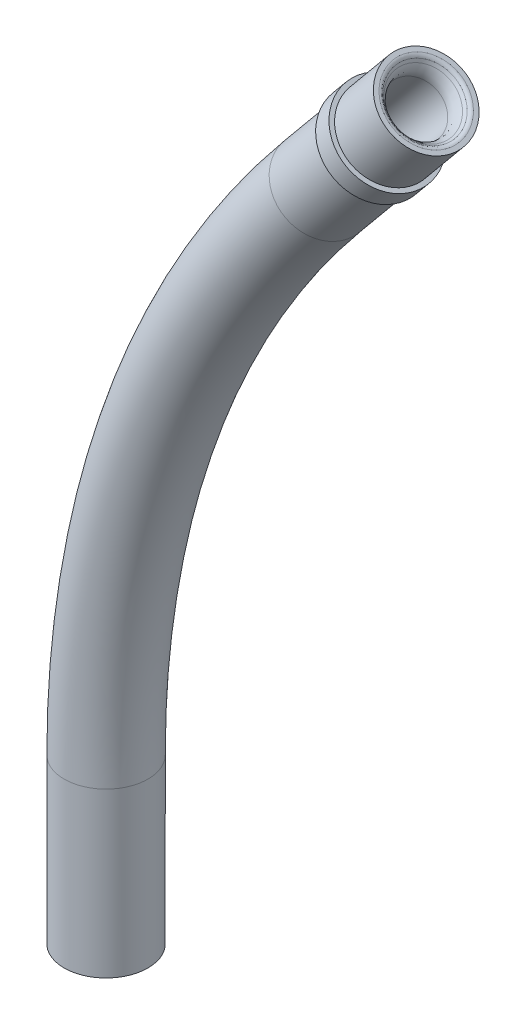
ISO-10303-21;
HEADER;
FILE_DESCRIPTION(('STEP AP214'),'2;1');
FILE_NAME('part.step','',(''),(''),'','','');
FILE_SCHEMA(('AUTOMOTIVE_DESIGN { 1 0 10303 214 1 1 1 1 }'));
ENDSEC;
DATA;
#1=APPLICATION_CONTEXT('core data for automotive mechanical design processes');
#2=APPLICATION_PROTOCOL_DEFINITION('international standard','automotive_design',2000,#1);
#3=PRODUCT_CONTEXT('',#1,'mechanical');
#4=PRODUCT('Part','Part','',(#3));
#5=PRODUCT_RELATED_PRODUCT_CATEGORY('part','',(#4));
#6=PRODUCT_DEFINITION_FORMATION('','',#4);
#7=PRODUCT_DEFINITION_CONTEXT('part definition',#1,'design');
#8=PRODUCT_DEFINITION('design','',#6,#7);
#9=PRODUCT_DEFINITION_SHAPE('','',#8);
#10=(LENGTH_UNIT() NAMED_UNIT(*) SI_UNIT(.MILLI.,.METRE.));
#11=(NAMED_UNIT(*) PLANE_ANGLE_UNIT() SI_UNIT($,.RADIAN.));
#12=(NAMED_UNIT(*) SI_UNIT($,.STERADIAN.) SOLID_ANGLE_UNIT());
#13=UNCERTAINTY_MEASURE_WITH_UNIT(LENGTH_MEASURE(1.E-05),#10,'distance_accuracy_value','');
#14=(GEOMETRIC_REPRESENTATION_CONTEXT(3) GLOBAL_UNCERTAINTY_ASSIGNED_CONTEXT((#13)) GLOBAL_UNIT_ASSIGNED_CONTEXT((#10,
#11,#12)) REPRESENTATION_CONTEXT('',''));
#15=CARTESIAN_POINT('',(0.,0.,0.));
#16=DIRECTION('',(0.,0.,1.));
#17=DIRECTION('',(1.,0.,0.));
#18=AXIS2_PLACEMENT_3D('',#15,#16,#17);
#19=CARTESIAN_POINT('',(30.5777697028413,85.,0.));
#20=DIRECTION('',(-0.637036868809193,-0.770833333333334,0.));
#21=DIRECTION('',(0.770833333333335,-0.637036868809193,0.));
#22=AXIS2_PLACEMENT_3D('',#19,#20,#21);
#23=CYLINDRICAL_SURFACE('',#22,4.425);
#24=CARTESIAN_POINT('',(25.6013848514208,78.9784280772626,0.));
#25=DIRECTION('',(0.637036868809194,0.770833333333333,0.));
#26=DIRECTION('',(-0.770833333333333,0.637036868809194,0.));
#27=AXIS2_PLACEMENT_3D('',#24,#25,#26);
#28=CIRCLE('',#27,4.425);
#29=CARTESIAN_POINT('',(22.1904473514208,81.7973162217433,0.));
#30=VERTEX_POINT('',#29);
#31=EDGE_CURVE('E319',#30,#30,#28,.T.);
#32=ORIENTED_EDGE('',*,*,#31,.T.);
#33=EDGE_LOOP('',(#32));
#34=FACE_BOUND('',#33,.T.);
#35=CARTESIAN_POINT('',(26.8754585890392,80.5200947439292,0.));
#36=DIRECTION('',(0.637036868809194,0.770833333333333,0.));
#37=DIRECTION('',(-0.770833333333333,0.637036868809194,0.));
#38=AXIS2_PLACEMENT_3D('',#35,#36,#37);
#39=CIRCLE('',#38,4.425);
#40=CARTESIAN_POINT('',(23.4645210890392,83.3389828884099,0.));
#41=VERTEX_POINT('',#40);
#42=EDGE_CURVE('E323',#41,#41,#39,.F.);
#43=ORIENTED_EDGE('',*,*,#42,.T.);
#44=EDGE_LOOP('',(#43));
#45=FACE_BOUND('',#44,.T.);
#46=ADVANCED_FACE('F53',(#34,#45),#23,.T.);
#47=CARTESIAN_POINT('',(20.6250000000002,72.9568561545252,0.));
#48=DIRECTION('',(0.637036868809194,0.770833333333334,0.));
#49=DIRECTION('',(-0.770833333333334,0.637036868809194,0.));
#50=AXIS2_PLACEMENT_3D('',#47,#48,#49);
#51=CYLINDRICAL_SURFACE('',#50,4.);
#52=CARTESIAN_POINT('',(20.6249999999999,72.9568561545253,0.));
#53=DIRECTION('',(-0.637036868809194,-0.770833333333333,0.));
#54=DIRECTION('',(0.770833333333333,-0.637036868809194,0.));
#55=AXIS2_PLACEMENT_3D('',#52,#53,#54);
#56=CIRCLE('',#55,4.);
#57=CARTESIAN_POINT('',(17.5416666666668,75.5050036297619,0.));
#58=VERTEX_POINT('',#57);
#59=EDGE_CURVE('E86',#58,#58,#56,.T.);
#60=ORIENTED_EDGE('',*,*,#59,.F.);
#61=EDGE_LOOP('',(#60));
#62=FACE_BOUND('',#61,.T.);
#63=CARTESIAN_POINT('',(25.6013848514207,78.9784280772626,0.));
#64=DIRECTION('',(0.637036868809194,0.770833333333333,0.));
#65=DIRECTION('',(-0.770833333333333,0.637036868809194,0.));
#66=AXIS2_PLACEMENT_3D('',#63,#64,#65);
#67=CIRCLE('',#66,4.);
#68=CARTESIAN_POINT('',(22.5180515180874,81.5265755524994,0.));
#69=VERTEX_POINT('',#68);
#70=EDGE_CURVE('E81',#69,#69,#67,.T.);
#71=ORIENTED_EDGE('',*,*,#70,.F.);
#72=EDGE_LOOP('',(#71));
#73=FACE_BOUND('',#72,.T.);
#74=ADVANCED_FACE('F129',(#62,#73),#51,.T.);
#75=CARTESIAN_POINT('',(0.,0.,0.));
#76=DIRECTION('',(0.,-1.,0.));
#77=DIRECTION('',(1.,0.,0.));
#78=AXIS2_PLACEMENT_3D('',#75,#76,#77);
#79=PLANE('',#78);
#80=CARTESIAN_POINT('',(0.,0.,0.));
#81=DIRECTION('',(0.,-1.,0.));
#82=DIRECTION('',(1.,0.,0.));
#83=AXIS2_PLACEMENT_3D('',#80,#81,#82);
#84=CIRCLE('',#83,2.5);
#85=CARTESIAN_POINT('',(2.5,0.,0.));
#86=VERTEX_POINT('',#85);
#87=EDGE_CURVE('E314',#86,#86,#84,.T.);
#88=ORIENTED_EDGE('',*,*,#87,.F.);
#89=EDGE_LOOP('',(#88));
#90=FACE_BOUND('',#89,.T.);
#91=CARTESIAN_POINT('',(0.,0.,0.));
#92=DIRECTION('',(0.,-1.,0.));
#93=DIRECTION('',(1.,0.,0.));
#94=AXIS2_PLACEMENT_3D('',#91,#92,#93);
#95=CIRCLE('',#94,4.);
#96=CARTESIAN_POINT('',(4.,0.,0.));
#97=VERTEX_POINT('',#96);
#98=EDGE_CURVE('E317',#97,#97,#95,.T.);
#99=ORIENTED_EDGE('',*,*,#98,.T.);
#100=EDGE_LOOP('',(#99));
#101=FACE_BOUND('',#100,.T.);
#102=ADVANCED_FACE('F134',(#90,#101),#79,.T.);
#103=CARTESIAN_POINT('',(0.,0.,0.));
#104=DIRECTION('',(0.,1.,0.));
#105=DIRECTION('',(0.,0.,1.));
#106=AXIS2_PLACEMENT_3D('',#103,#104,#105);
#107=CYLINDRICAL_SURFACE('',#106,4.);
#108=CARTESIAN_POINT('',(0.,15.6235379616971,0.));
#109=DIRECTION('',(0.,-1.,0.));
#110=DIRECTION('',(1.,0.,0.));
#111=AXIS2_PLACEMENT_3D('',#108,#109,#110);
#112=CIRCLE('',#111,4.);
#113=CARTESIAN_POINT('',(-4.00000000000002,15.6235379616971,0.));
#114=VERTEX_POINT('',#113);
#115=EDGE_CURVE('E91',#114,#114,#112,.T.);
#116=ORIENTED_EDGE('',*,*,#115,.T.);
#117=EDGE_LOOP('',(#116));
#118=FACE_BOUND('',#117,.T.);
#119=ORIENTED_EDGE('',*,*,#98,.F.);
#120=EDGE_LOOP('',(#119));
#121=FACE_BOUND('',#120,.T.);
#122=ADVANCED_FACE('F135',(#118,#121),#107,.T.);
#123=CARTESIAN_POINT('',(90.,15.6235379616975,0.));
#124=DIRECTION('',(0.,0.,-1.));
#125=DIRECTION('',(-1.,0.,0.));
#126=AXIS2_PLACEMENT_3D('',#123,#124,#125);
#127=TOROIDAL_SURFACE('',#126,90.,4.);
#128=CARTESIAN_POINT('',(90.,15.6235379616975,0.));
#129=DIRECTION('',(0.,0.,-1.));
#130=DIRECTION('',(-1.,0.,0.));
#131=AXIS2_PLACEMENT_3D('',#128,#129,#130);
#132=CIRCLE('',#131,94.);
#133=EDGE_CURVE('',#114,#58,#132,.T.);
#134=ORIENTED_EDGE('',*,*,#115,.F.);
#135=ORIENTED_EDGE('',*,*,#59,.T.);
#136=ORIENTED_EDGE('',*,*,#133,.T.);
#137=ORIENTED_EDGE('',*,*,#133,.F.);
#138=EDGE_LOOP('',(#134,#136,#135,#137));
#139=FACE_BOUND('',#138,.T.);
#140=ADVANCED_FACE('F133',(#139),#127,.T.);
#141=CARTESIAN_POINT('',(25.6013848514208,78.9784280772626,0.));
#142=DIRECTION('',(0.637036868809194,0.770833333333333,0.));
#143=DIRECTION('',(-0.770833333333333,0.637036868809194,0.));
#144=AXIS2_PLACEMENT_3D('',#141,#142,#143);
#145=PLANE('',#144);
#146=ORIENTED_EDGE('',*,*,#70,.T.);
#147=EDGE_LOOP('',(#146));
#148=FACE_BOUND('',#147,.T.);
#149=ORIENTED_EDGE('',*,*,#31,.F.);
#150=EDGE_LOOP('',(#149));
#151=FACE_BOUND('',#150,.T.);
#152=ADVANCED_FACE('F122',(#148,#151),#145,.F.);
#153=CARTESIAN_POINT('',(17.6283651619462,69.3308399314486,0.));
#154=DIRECTION('',(0.637036868809194,0.770833333333333,0.));
#155=DIRECTION('',(-0.770833333333333,0.637036868809194,0.));
#156=AXIS2_PLACEMENT_3D('',#153,#154,#155);
#157=CYLINDRICAL_SURFACE('',#156,3.99999999999963);
#158=CARTESIAN_POINT('',(26.8754585890392,80.5200947439292,0.));
#159=DIRECTION('',(0.637036868809194,0.770833333333333,0.));
#160=DIRECTION('',(-0.770833333333333,0.637036868809194,0.));
#161=AXIS2_PLACEMENT_3D('',#158,#159,#160);
#162=CIRCLE('',#161,3.99999999999963);
#163=CARTESIAN_POINT('',(23.7921252557061,83.0682422191658,0.));
#164=VERTEX_POINT('',#163);
#165=EDGE_CURVE('E329',#164,#164,#162,.F.);
#166=ORIENTED_EDGE('',*,*,#165,.F.);
#167=EDGE_LOOP('',(#166));
#168=FACE_BOUND('',#167,.T.);
#169=CARTESIAN_POINT('',(30.5777697028413,85.,0.));
#170=DIRECTION('',(0.637036868809194,0.770833333333333,0.));
#171=DIRECTION('',(-0.770833333333333,0.637036868809194,0.));
#172=AXIS2_PLACEMENT_3D('',#169,#170,#171);
#173=CIRCLE('',#172,3.99999999999963);
#174=CARTESIAN_POINT('',(27.4944363695083,87.5481474752365,0.));
#175=VERTEX_POINT('',#174);
#176=EDGE_CURVE('E328',#175,#175,#173,.T.);
#177=ORIENTED_EDGE('',*,*,#176,.F.);
#178=EDGE_LOOP('',(#177));
#179=FACE_BOUND('',#178,.T.);
#180=ADVANCED_FACE('F118',(#168,#179),#157,.T.);
#181=CARTESIAN_POINT('',(26.8754585890392,80.5200947439292,0.));
#182=DIRECTION('',(0.637036868809194,0.770833333333333,0.));
#183=DIRECTION('',(-0.770833333333333,0.637036868809194,0.));
#184=AXIS2_PLACEMENT_3D('',#181,#182,#183);
#185=PLANE('',#184);
#186=ORIENTED_EDGE('',*,*,#42,.F.);
#187=EDGE_LOOP('',(#186));
#188=FACE_BOUND('',#187,.T.);
#189=ORIENTED_EDGE('',*,*,#165,.T.);
#190=EDGE_LOOP('',(#189));
#191=FACE_BOUND('',#190,.T.);
#192=ADVANCED_FACE('F121',(#188,#191),#185,.T.);
#193=CARTESIAN_POINT('',(30.5777697028413,85.,0.));
#194=DIRECTION('',(-0.637036868809194,-0.770833333333333,0.));
#195=DIRECTION('',(0.770833333333333,-0.637036868809194,0.));
#196=AXIS2_PLACEMENT_3D('',#193,#194,#195);
#197=PLANE('',#196);
#198=CARTESIAN_POINT('',(33.331381745121,82.7243428410865,0.));
#199=CARTESIAN_POINT('',(33.331381745121,82.7243428410865,-0.933086446171184));
#200=CARTESIAN_POINT('',(32.7355321096122,83.2167685960085,-2.79925933851356));
#201=CARTESIAN_POINT('',(30.5777697028413,85.,-3.95875052112539));
#202=CARTESIAN_POINT('',(28.4200072960704,86.7832314039916,-2.79925933851355));
#203=CARTESIAN_POINT('',(27.5262328428071,87.5218700363745,0.));
#204=CARTESIAN_POINT('',(28.4200072960704,86.7832314039916,2.79925933851354));
#205=CARTESIAN_POINT('',(30.5777697028413,85.,3.9587505211254));
#206=CARTESIAN_POINT('',(32.7355321096122,83.2167685960085,2.79925933851354));
#207=CARTESIAN_POINT('',(33.331381745121,82.7243428410865,0.933086446171184));
#208=CARTESIAN_POINT('',(33.331381745121,82.7243428410865,0.));
#209=B_SPLINE_CURVE_WITH_KNOTS('',3,(#198,#199,#200,#201,#202,#203,#204,#205,#206,#207,#208),
.UNSPECIFIED.,.T.,.F.,(4,1,1,1,1,1,1,1,4),(0.,0.785398163397448,1.5707963267949,
2.35619449019235,3.14159265358979,3.92699081698724,4.71238898038469,5.49778714378214,
6.28318530717959),.UNSPECIFIED.);
#210=CARTESIAN_POINT('',(33.331381745121,82.7243428410865,0.));
#211=VERTEX_POINT('',#210);
#212=EDGE_CURVE('E66',#211,#211,#209,.F.);
#213=ORIENTED_EDGE('',*,*,#212,.T.);
#214=EDGE_LOOP('',(#213));
#215=FACE_BOUND('',#214,.T.);
#216=ORIENTED_EDGE('',*,*,#176,.T.);
#217=EDGE_LOOP('',(#216));
#218=FACE_BOUND('',#217,.T.);
#219=ADVANCED_FACE('F116',(#215,#218),#197,.F.);
#220=CARTESIAN_POINT('',(0.,-1.,0.));
#221=DIRECTION('',(0.,1.,0.));
#222=DIRECTION('',(0.,0.,1.));
#223=AXIS2_PLACEMENT_3D('',#220,#221,#222);
#224=CYLINDRICAL_SURFACE('',#223,2.5);
#225=CARTESIAN_POINT('',(0.,15.6235379616971,0.));
#226=DIRECTION('',(0.,-1.,0.));
#227=DIRECTION('',(1.,0.,0.));
#228=AXIS2_PLACEMENT_3D('',#225,#226,#227);
#229=CIRCLE('',#228,2.5);
#230=CARTESIAN_POINT('',(-2.50000000000002,15.6235379616971,0.));
#231=VERTEX_POINT('',#230);
#232=EDGE_CURVE('E336',#231,#231,#229,.T.);
#233=ORIENTED_EDGE('',*,*,#232,.F.);
#234=EDGE_LOOP('',(#233));
#235=FACE_BOUND('',#234,.T.);
#236=ORIENTED_EDGE('',*,*,#87,.T.);
#237=EDGE_LOOP('',(#236));
#238=FACE_BOUND('',#237,.T.);
#239=ADVANCED_FACE('F110',(#235,#238),#224,.F.);
#240=CARTESIAN_POINT('',(90.,15.6235379616975,0.));
#241=DIRECTION('',(0.,0.,-1.));
#242=DIRECTION('',(-1.,0.,0.));
#243=AXIS2_PLACEMENT_3D('',#240,#241,#242);
#244=TOROIDAL_SURFACE('',#243,90.,2.5);
#245=CARTESIAN_POINT('',(20.6250000000002,72.9568561545252,0.));
#246=DIRECTION('',(-0.637036868809197,-0.770833333333331,0.));
#247=DIRECTION('',(0.770833333333331,-0.637036868809197,0.));
#248=AXIS2_PLACEMENT_3D('',#245,#246,#247);
#249=CIRCLE('',#248,2.5);
#250=CARTESIAN_POINT('',(18.6979166666668,74.5494483265481,0.));
#251=VERTEX_POINT('',#250);
#252=EDGE_CURVE('E335',#251,#251,#249,.T.);
#253=CARTESIAN_POINT('',(90.,15.6235379616975,0.));
#254=DIRECTION('',(0.,0.,-1.));
#255=DIRECTION('',(-1.,0.,0.));
#256=AXIS2_PLACEMENT_3D('',#253,#254,#255);
#257=CIRCLE('',#256,92.5);
#258=EDGE_CURVE('',#231,#251,#257,.T.);
#259=ORIENTED_EDGE('',*,*,#232,.T.);
#260=ORIENTED_EDGE('',*,*,#252,.F.);
#261=ORIENTED_EDGE('',*,*,#258,.T.);
#262=ORIENTED_EDGE('',*,*,#258,.F.);
#263=EDGE_LOOP('',(#259,#261,#260,#262));
#264=FACE_BOUND('',#263,.T.);
#265=ADVANCED_FACE('F109',(#264),#244,.F.);
#266=CARTESIAN_POINT('',(20.6250000000002,72.9568561545252,0.));
#267=DIRECTION('',(0.637036868809194,0.770833333333334,0.));
#268=DIRECTION('',(-0.770833333333334,0.637036868809194,0.));
#269=AXIS2_PLACEMENT_3D('',#266,#267,#268);
#270=CYLINDRICAL_SURFACE('',#269,2.5);
#271=CARTESIAN_POINT('',(31.4040912506121,82.0754537168167,0.));
#272=CARTESIAN_POINT('',(31.4040912506121,82.0754537168167,0.32720519784583));
#273=CARTESIAN_POINT('',(31.30375162814,82.158377010547,0.981615593537496));
#274=CARTESIAN_POINT('',(30.8751370239262,82.5125953526801,1.81378911132641));
#275=CARTESIAN_POINT('',(30.2336699372972,83.0427205647583,2.36982967895512));
#276=CARTESIAN_POINT('',(29.4770079172787,83.6680458888397,2.56508516052245));
#277=CARTESIAN_POINT('',(28.7203458972602,84.293371212921,2.36982967895512));
#278=CARTESIAN_POINT('',(28.0788788106313,84.8234964249992,1.8137891113264));
#279=CARTESIAN_POINT('',(27.6502642064175,85.1777147671323,0.981615593537479));
#280=CARTESIAN_POINT('',(27.4997547727093,85.3020997077278,0.));
#281=CARTESIAN_POINT('',(27.6502642064175,85.1777147671323,-0.981615593537491));
#282=CARTESIAN_POINT('',(28.0788788106313,84.8234964249992,-1.81378911132641));
#283=CARTESIAN_POINT('',(28.7203458972603,84.293371212921,-2.36982967895512));
#284=CARTESIAN_POINT('',(29.4770079172787,83.6680458888397,-2.56508516052245));
#285=CARTESIAN_POINT('',(30.2336699372972,83.0427205647582,-2.36982967895511));
#286=CARTESIAN_POINT('',(30.8751370239262,82.5125953526801,-1.81378911132641));
#287=CARTESIAN_POINT('',(31.30375162814,82.158377010547,-0.981615593537479));
#288=CARTESIAN_POINT('',(31.4040912506121,82.0754537168167,-0.327205197845829));
#289=CARTESIAN_POINT('',(31.4040912506121,82.0754537168167,0.));
#290=B_SPLINE_CURVE_WITH_KNOTS('',3,(#271,#272,#273,#274,#275,#276,#277,#278,#279,#280,#281,
#282,#283,#284,#285,#286,#287,#288,#289),.UNSPECIFIED.,.T.,.F.,(4,1,1,1,1,1,1,1,1,1,1,1,1,1,1,1,
4),(3.14159265358979,3.53429173528852,3.92699081698724,4.31968989868597,4.71238898038469,
5.10508806208341,5.49778714378214,5.89048622548086,6.28318530717959,6.67588438887831,
7.06858347057703,7.46128255227576,7.85398163397448,8.24668071567321,8.63937979737193,
9.03207887907065,9.42477796076938),.UNSPECIFIED.);
#291=CARTESIAN_POINT('',(31.4040912506121,82.0754537168167,0.));
#292=VERTEX_POINT('',#291);
#293=EDGE_CURVE('E76',#292,#292,#290,.F.);
#294=ORIENTED_EDGE('',*,*,#293,.T.);
#295=EDGE_LOOP('',(#294));
#296=FACE_BOUND('',#295,.T.);
#297=ORIENTED_EDGE('',*,*,#252,.T.);
#298=EDGE_LOOP('',(#297));
#299=FACE_BOUND('',#298,.T.);
#300=ADVANCED_FACE('F99',(#296,#299),#270,.F.);
#301=CARTESIAN_POINT('',(30.5777697028413,85.,0.));
#302=DIRECTION('',(0.637036868809193,0.770833333333334,0.));
#303=DIRECTION('',(-0.770833333333334,0.637036868809193,0.));
#304=AXIS2_PLACEMENT_3D('',#301,#302,#303);
#305=CONICAL_SURFACE('',#304,3.33909963117728,0.69813170079772);
#306=CARTESIAN_POINT('',(32.922356718023,82.8306665090265,0.));
#307=CARTESIAN_POINT('',(32.922356718023,82.8306665090265,0.833039557702626));
#308=CARTESIAN_POINT('',(32.3903949487161,83.2702936569341,2.49911867310787));
#309=CARTESIAN_POINT('',(30.4639909715287,84.8623243912334,3.53428752148901));
#310=CARTESIAN_POINT('',(28.5375869943414,86.4543551255326,2.49911867310787));
#311=CARTESIAN_POINT('',(27.7396443403809,87.1137958473941,0.));
#312=CARTESIAN_POINT('',(28.5375869943414,86.4543551255326,-2.49911867310787));
#313=CARTESIAN_POINT('',(30.4639909715287,84.8623243912334,-3.534287521489));
#314=CARTESIAN_POINT('',(32.3903949487161,83.2702936569342,-2.49911867310788));
#315=CARTESIAN_POINT('',(32.922356718023,82.8306665090265,-0.833039557702626));
#316=CARTESIAN_POINT('',(32.922356718023,82.8306665090265,0.));
#317=B_SPLINE_CURVE_WITH_KNOTS('',3,(#306,#307,#308,#309,#310,#311,#312,#313,#314,#315,#316),
.UNSPECIFIED.,.T.,.F.,(4,1,1,1,1,1,1,1,4),(0.,0.785398163397448,1.5707963267949,
2.35619449019234,3.14159265358979,3.92699081698724,4.71238898038469,5.49778714378214,
6.28318530717959),.UNSPECIFIED.);
#318=CARTESIAN_POINT('',(32.922356718023,82.8306665090265,0.));
#319=VERTEX_POINT('',#318);
#320=EDGE_CURVE('E12',#319,#319,#317,.F.);
#321=ORIENTED_EDGE('',*,*,#320,.T.);
#322=EDGE_LOOP('',(#321));
#323=FACE_BOUND('',#322,.T.);
#324=CARTESIAN_POINT('',(32.583731546505,82.7683413176247,0.));
#325=CARTESIAN_POINT('',(32.583731546505,82.7683413176247,-0.388446377266933));
#326=CARTESIAN_POINT('',(32.4646119142308,82.8667849036455,-1.16533913180079));
#327=CARTESIAN_POINT('',(31.955775895284,83.2873003253716,-2.15326594461047));
#328=CARTESIAN_POINT('',(31.1942489770766,83.9166461288165,-2.81337753675758));
#329=CARTESIAN_POINT('',(30.2959667296468,84.6590101204397,-3.04517790226424));
#330=CARTESIAN_POINT('',(29.397684482217,85.4013741120629,-2.81337753675759));
#331=CARTESIAN_POINT('',(28.6361575640096,86.0307199155078,-2.15326594461047));
#332=CARTESIAN_POINT('',(28.1273215450628,86.4512353372339,-1.16533913180081));
#333=CARTESIAN_POINT('',(27.9486420966515,86.598900716265,0.));
#334=CARTESIAN_POINT('',(28.1273215450628,86.4512353372339,1.16533913180079));
#335=CARTESIAN_POINT('',(28.6361575640096,86.0307199155078,2.15326594461046));
#336=CARTESIAN_POINT('',(29.397684482217,85.4013741120629,2.81337753675758));
#337=CARTESIAN_POINT('',(30.2959667296468,84.6590101204397,3.04517790226424));
#338=CARTESIAN_POINT('',(31.1942489770766,83.9166461288165,2.81337753675759));
#339=CARTESIAN_POINT('',(31.955775895284,83.2873003253716,2.15326594461047));
#340=CARTESIAN_POINT('',(32.4646119142308,82.8667849036456,1.16533913180081));
#341=CARTESIAN_POINT('',(32.583731546505,82.7683413176247,0.388446377266935));
#342=CARTESIAN_POINT('',(32.583731546505,82.7683413176247,0.));
#343=B_SPLINE_CURVE_WITH_KNOTS('',3,(#324,#325,#326,#327,#328,#329,#330,#331,#332,#333,#334,
#335,#336,#337,#338,#339,#340,#341,#342),.UNSPECIFIED.,.T.,.F.,(4,1,1,1,1,1,1,1,1,1,1,1,1,1,1,1,
4),(3.14159265358979,3.53429173528852,3.92699081698724,4.31968989868597,4.71238898038469,
5.10508806208341,5.49778714378214,5.89048622548086,6.28318530717959,6.67588438887831,
7.06858347057703,7.46128255227576,7.85398163397448,8.24668071567321,8.63937979737193,
9.03207887907065,9.42477796076938),.UNSPECIFIED.);
#344=CARTESIAN_POINT('',(32.583731546505,82.7683413176247,0.));
#345=VERTEX_POINT('',#344);
#346=EDGE_CURVE('E71',#345,#345,#343,.F.);
#347=ORIENTED_EDGE('',*,*,#346,.T.);
#348=EDGE_LOOP('',(#347));
#349=FACE_BOUND('',#348,.T.);
#350=ADVANCED_FACE('F108',(#323,#349),#305,.F.);
#351=CARTESIAN_POINT('',(31.4040912506121,82.0754537168167,0.));
#352=CARTESIAN_POINT('',(31.4040912506121,82.0754537168167,-0.327205197845829));
#353=CARTESIAN_POINT('',(31.30375162814,82.158377010547,-0.981615593537479));
#354=CARTESIAN_POINT('',(30.8751370239262,82.5125953526801,-1.81378911132641));
#355=CARTESIAN_POINT('',(30.2336699372972,83.0427205647582,-2.36982967895511));
#356=CARTESIAN_POINT('',(29.4770079172787,83.6680458888397,-2.56508516052245));
#357=CARTESIAN_POINT('',(28.7203458972603,84.293371212921,-2.36982967895512));
#358=CARTESIAN_POINT('',(28.0788788106313,84.8234964249992,-1.81378911132641));
#359=CARTESIAN_POINT('',(27.6502642064175,85.1777147671323,-0.981615593537491));
#360=CARTESIAN_POINT('',(27.4997547727093,85.3020997077278,0.));
#361=CARTESIAN_POINT('',(27.6502642064175,85.1777147671323,0.981615593537479));
#362=CARTESIAN_POINT('',(28.0788788106313,84.8234964249992,1.8137891113264));
#363=CARTESIAN_POINT('',(28.7203458972602,84.293371212921,2.36982967895512));
#364=CARTESIAN_POINT('',(29.4770079172787,83.6680458888397,2.56508516052245));
#365=CARTESIAN_POINT('',(30.2336699372972,83.0427205647583,2.36982967895512));
#366=CARTESIAN_POINT('',(30.8751370239262,82.5125953526801,1.81378911132641));
#367=CARTESIAN_POINT('',(31.30375162814,82.158377010547,0.981615593537496));
#368=CARTESIAN_POINT('',(31.4040912506121,82.0754537168167,0.32720519784583));
#369=CARTESIAN_POINT('',(31.4040912506121,82.0754537168167,0.));
#370=CARTESIAN_POINT('',(31.4894176738233,82.1787011965869,0.));
#371=CARTESIAN_POINT('',(31.4894176738233,82.1787011965869,-0.327205197845829));
#372=CARTESIAN_POINT('',(31.3890780513512,82.2616244903172,-0.981615593537479));
#373=CARTESIAN_POINT('',(30.9604634471373,82.6158428324503,-1.81378911132641));
#374=CARTESIAN_POINT('',(30.3189963605084,83.1459680445285,-2.36982967895511));
#375=CARTESIAN_POINT('',(29.5623343404899,83.7712933686099,-2.56508516052245));
#376=CARTESIAN_POINT('',(28.8056723204715,84.3966186926913,-2.36982967895512));
#377=CARTESIAN_POINT('',(28.1642052338425,84.9267439047695,-1.81378911132641));
#378=CARTESIAN_POINT('',(27.7355906296287,85.2809622469026,-0.981615593537491));
#379=CARTESIAN_POINT('',(27.5850811959205,85.4053471874981,0.));
#380=CARTESIAN_POINT('',(27.7355906296287,85.2809622469026,0.981615593537479));
#381=CARTESIAN_POINT('',(28.1642052338425,84.9267439047695,1.8137891113264));
#382=CARTESIAN_POINT('',(28.8056723204714,84.3966186926913,2.36982967895512));
#383=CARTESIAN_POINT('',(29.5623343404899,83.7712933686099,2.56508516052245));
#384=CARTESIAN_POINT('',(30.3189963605084,83.1459680445285,2.36982967895512));
#385=CARTESIAN_POINT('',(30.9604634471374,82.6158428324504,1.81378911132641));
#386=CARTESIAN_POINT('',(31.3890780513512,82.2616244903172,0.981615593537496));
#387=CARTESIAN_POINT('',(31.4894176738233,82.1787011965869,0.32720519784583));
#388=CARTESIAN_POINT('',(31.4894176738233,82.1787011965869,0.));
#389=CARTESIAN_POINT('',(31.5747440970345,82.2819486763572,0.));
#390=CARTESIAN_POINT('',(31.5747440970345,82.2819486763572,-0.327205197845829));
#391=CARTESIAN_POINT('',(31.4744044745624,82.3648719700875,-0.98161559353748));
#392=CARTESIAN_POINT('',(31.0457898703485,82.7190903122206,-1.81378911132641));
#393=CARTESIAN_POINT('',(30.4043227837196,83.2492155242988,-2.36982967895511));
#394=CARTESIAN_POINT('',(29.6476607637011,83.8745408483802,-2.56508516052245));
#395=CARTESIAN_POINT('',(28.8909987436826,84.4998661724616,-2.36982967895512));
#396=CARTESIAN_POINT('',(28.2495316570537,85.0299913845398,-1.81378911132641));
#397=CARTESIAN_POINT('',(27.8209170528399,85.3842097266729,-0.981615593537491));
#398=CARTESIAN_POINT('',(27.6704076191317,85.5085946672684,0.));
#399=CARTESIAN_POINT('',(27.8209170528399,85.3842097266729,0.98161559353748));
#400=CARTESIAN_POINT('',(28.2495316570537,85.0299913845398,1.8137891113264));
#401=CARTESIAN_POINT('',(28.8909987436826,84.4998661724616,2.36982967895512));
#402=CARTESIAN_POINT('',(29.6476607637011,83.8745408483802,2.56508516052245));
#403=CARTESIAN_POINT('',(30.4043227837196,83.2492155242988,2.36982967895512));
#404=CARTESIAN_POINT('',(31.0457898703486,82.7190903122206,1.81378911132641));
#405=CARTESIAN_POINT('',(31.4744044745624,82.3648719700876,0.981615593537496));
#406=CARTESIAN_POINT('',(31.5747440970345,82.2819486763572,0.32720519784583));
#407=CARTESIAN_POINT('',(31.5747440970345,82.2819486763572,0.));
#408=CARTESIAN_POINT('',(31.7820055715882,82.4981400424254,0.));
#409=CARTESIAN_POINT('',(31.7820055715882,82.4981400424254,-0.330090124506841));
#410=CARTESIAN_POINT('',(31.6807812674119,82.581794460302,-0.990270373520517));
#411=CARTESIAN_POINT('',(31.2483876226843,82.9391359005574,-1.82978105949585));
#412=CARTESIAN_POINT('',(30.601264802245,83.473935159283,-2.39072416616952));
#413=CARTESIAN_POINT('',(29.837931389323,84.1047738973051,-2.58770119051243));
#414=CARTESIAN_POINT('',(29.0745979764009,84.7356126353271,-2.39072416616952));
#415=CARTESIAN_POINT('',(28.4274751559616,85.2704118940527,-1.82978105949585));
#416=CARTESIAN_POINT('',(27.9950815112339,85.6277533343081,-0.990270373520528));
#417=CARTESIAN_POINT('',(27.8432450549696,85.753234961123,0.));
#418=CARTESIAN_POINT('',(27.9950815112339,85.6277533343081,0.990270373520518));
#419=CARTESIAN_POINT('',(28.4274751559616,85.2704118940527,1.82978105949583));
#420=CARTESIAN_POINT('',(29.0745979764009,84.7356126353271,2.39072416616952));
#421=CARTESIAN_POINT('',(29.837931389323,84.1047738973051,2.58770119051243));
#422=CARTESIAN_POINT('',(30.601264802245,83.473935159283,2.39072416616952));
#423=CARTESIAN_POINT('',(31.2483876226843,82.9391359005575,1.82978105949584));
#424=CARTESIAN_POINT('',(31.6807812674119,82.581794460302,0.990270373520533));
#425=CARTESIAN_POINT('',(31.7820055715882,82.4981400424254,0.330090124506842));
#426=CARTESIAN_POINT('',(31.7820055715882,82.4981400424254,0.));
#427=CARTESIAN_POINT('',(32.0305146993585,82.6441073291646,0.));
#428=CARTESIAN_POINT('',(32.0305146993585,82.6441073291646,-0.342991508203676));
#429=CARTESIAN_POINT('',(31.9253341011563,82.7310313321115,-1.02897452461102));
#430=CARTESIAN_POINT('',(31.476040598164,83.1023392581514,-1.90129700552733));
#431=CARTESIAN_POINT('',(30.8036253524578,83.6580408399862,-2.48416425265236));
#432=CARTESIAN_POINT('',(30.0104574897367,84.3135355492289,-2.6888400113161));
#433=CARTESIAN_POINT('',(29.2172896270158,84.9690302584715,-2.48416425265236));
#434=CARTESIAN_POINT('',(28.5448743813094,85.5247318403063,-1.90129700552733));
#435=CARTESIAN_POINT('',(28.0955808783172,85.8960397663462,-1.02897452461103));
#436=CARTESIAN_POINT('',(27.9378099810139,86.0264257707666,0.));
#437=CARTESIAN_POINT('',(28.0955808783172,85.8960397663462,1.02897452461102));
#438=CARTESIAN_POINT('',(28.5448743813094,85.5247318403063,1.90129700552732));
#439=CARTESIAN_POINT('',(29.2172896270157,84.9690302584715,2.48416425265236));
#440=CARTESIAN_POINT('',(30.0104574897367,84.3135355492289,2.6888400113161));
#441=CARTESIAN_POINT('',(30.8036253524578,83.6580408399862,2.48416425265236));
#442=CARTESIAN_POINT('',(31.4760405981641,83.1023392581515,1.90129700552733));
#443=CARTESIAN_POINT('',(31.9253341011563,82.7310313321115,1.02897452461104));
#444=CARTESIAN_POINT('',(32.0305146993585,82.6441073291646,0.342991508203678));
#445=CARTESIAN_POINT('',(32.0305146993585,82.6441073291646,0.));
#446=CARTESIAN_POINT('',(32.3202714803454,82.7198505365747,0.));
#447=CARTESIAN_POINT('',(32.3202714803454,82.7198505365747,-0.365909348936333));
#448=CARTESIAN_POINT('',(32.2080629757953,82.8125825855161,-1.09772804680899));
#449=CARTESIAN_POINT('',(31.7287487967878,83.2087003850025,-2.02833694942087));
#450=CARTESIAN_POINT('',(31.0114044343578,83.8015325664083,-2.65014993840362));
#451=CARTESIAN_POINT('',(30.1652390649425,84.5008258041516,-2.86850162293346));
#452=CARTESIAN_POINT('',(29.3190736955272,85.2001190418948,-2.65014993840362));
#453=CARTESIAN_POINT('',(28.6017293330973,85.7929512233006,-2.02833694942087));
#454=CARTESIAN_POINT('',(28.1224151540897,86.1890690227871,-1.09772804680901));
#455=CARTESIAN_POINT('',(27.9541023972646,86.3281670961992,0.));
#456=CARTESIAN_POINT('',(28.1224151540897,86.189069022787,1.09772804680899));
#457=CARTESIAN_POINT('',(28.6017293330973,85.7929512233007,2.02833694942085));
#458=CARTESIAN_POINT('',(29.3190736955272,85.2001190418948,2.65014993840363));
#459=CARTESIAN_POINT('',(30.1652390649425,84.5008258041516,2.86850162293346));
#460=CARTESIAN_POINT('',(31.0114044343578,83.8015325664084,2.65014993840363));
#461=CARTESIAN_POINT('',(31.7287487967878,83.2087003850025,2.02833694942086));
#462=CARTESIAN_POINT('',(32.2080629757953,82.8125825855161,1.09772804680901));
#463=CARTESIAN_POINT('',(32.3202714803454,82.7198505365747,0.365909348936335));
#464=CARTESIAN_POINT('',(32.3202714803454,82.7198505365747,0.));
#465=CARTESIAN_POINT('',(32.4520015134252,82.7440959270997,0.));
#466=CARTESIAN_POINT('',(32.4520015134252,82.7440959270997,-0.377177863101634));
#467=CARTESIAN_POINT('',(32.336337445013,82.8396837445808,-1.13153358930489));
#468=CARTESIAN_POINT('',(31.8422623460359,83.248000355187,-2.09080144701568));
#469=CARTESIAN_POINT('',(31.1028267057172,83.8590893476124,-2.73176373758061));
#470=CARTESIAN_POINT('',(30.2306028972947,84.5799179622957,-2.95683976259886));
#471=CARTESIAN_POINT('',(29.3583790888721,85.3007465769789,-2.73176373758061));
#472=CARTESIAN_POINT('',(28.6189434485534,85.9118355694042,-2.09080144701568));
#473=CARTESIAN_POINT('',(28.1248683495763,86.3201521800105,-1.13153358930491));
#474=CARTESIAN_POINT('',(27.9513722469581,86.4635339062322,0.));
#475=CARTESIAN_POINT('',(28.1248683495763,86.3201521800105,1.1315335893049));
#476=CARTESIAN_POINT('',(28.6189434485534,85.9118355694043,2.09080144701566));
#477=CARTESIAN_POINT('',(29.3583790888721,85.3007465769789,2.73176373758061));
#478=CARTESIAN_POINT('',(30.2306028972947,84.5799179622956,2.95683976259885));
#479=CARTESIAN_POINT('',(31.1028267057172,83.8590893476125,2.73176373758062));
#480=CARTESIAN_POINT('',(31.8422623460359,83.2480003551871,2.09080144701567));
#481=CARTESIAN_POINT('',(32.3363374450131,82.8396837445808,1.13153358930491));
#482=CARTESIAN_POINT('',(32.4520015134252,82.7440959270997,0.377177863101635));
#483=CARTESIAN_POINT('',(32.4520015134252,82.7440959270997,0.));
#484=CARTESIAN_POINT('',(32.5837315465051,82.7683413176247,0.));
#485=CARTESIAN_POINT('',(32.5837315465051,82.7683413176247,-0.388446377266935));
#486=CARTESIAN_POINT('',(32.4646119142308,82.8667849036455,-1.1653391318008));
#487=CARTESIAN_POINT('',(31.9557758952841,83.2873003253716,-2.15326594461049));
#488=CARTESIAN_POINT('',(31.1942489770766,83.9166461288165,-2.81337753675759));
#489=CARTESIAN_POINT('',(30.2959667296468,84.6590101204397,-3.04517790226425));
#490=CARTESIAN_POINT('',(29.397684482217,85.4013741120629,-2.8133775367576));
#491=CARTESIAN_POINT('',(28.6361575640096,86.0307199155078,-2.15326594461048));
#492=CARTESIAN_POINT('',(28.1273215450628,86.4512353372339,-1.16533913180081));
#493=CARTESIAN_POINT('',(27.9486420966515,86.5989007162651,0.));
#494=CARTESIAN_POINT('',(28.1273215450628,86.4512353372339,1.1653391318008));
#495=CARTESIAN_POINT('',(28.6361575640096,86.0307199155078,2.15326594461047));
#496=CARTESIAN_POINT('',(29.397684482217,85.4013741120629,2.8133775367576));
#497=CARTESIAN_POINT('',(30.2959667296468,84.6590101204397,3.04517790226425));
#498=CARTESIAN_POINT('',(31.1942489770766,83.9166461288165,2.8133775367576));
#499=CARTESIAN_POINT('',(31.9557758952841,83.2873003253716,2.15326594461048));
#500=CARTESIAN_POINT('',(32.4646119142308,82.8667849036456,1.16533913180082));
#501=CARTESIAN_POINT('',(32.5837315465051,82.7683413176247,0.388446377266937));
#502=CARTESIAN_POINT('',(32.5837315465051,82.7683413176247,0.));
#503=B_SPLINE_SURFACE_WITH_KNOTS('',5,3,((#351,#352,#353,#354,#355,#356,#357,#358,#359,#360,
#361,#362,#363,#364,#365,#366,#367,#368,#369),(#370,#371,#372,#373,#374,#375,#376,#377,#378,
#379,#380,#381,#382,#383,#384,#385,#386,#387,#388),(#389,#390,#391,#392,#393,#394,#395,#396,
#397,#398,#399,#400,#401,#402,#403,#404,#405,#406,#407),(#408,#409,#410,#411,#412,#413,#414,
#415,#416,#417,#418,#419,#420,#421,#422,#423,#424,#425,#426),(#427,#428,#429,#430,#431,#432,
#433,#434,#435,#436,#437,#438,#439,#440,#441,#442,#443,#444,#445),(#446,#447,#448,#449,#450,
#451,#452,#453,#454,#455,#456,#457,#458,#459,#460,#461,#462,#463,#464),(#465,#466,#467,#468,
#469,#470,#471,#472,#473,#474,#475,#476,#477,#478,#479,#480,#481,#482,#483),(#484,#485,#486,
#487,#488,#489,#490,#491,#492,#493,#494,#495,#496,#497,#498,#499,#500,#501,#502)),.UNSPECIFIED.,
.F.,.T.,.F.,(6,2,6),(4,1,1,1,1,1,1,1,1,1,1,1,1,1,1,1,4),(0.,0.5,1.),(3.14159265358979,
3.53429173528852,3.92699081698724,4.31968989868597,4.71238898038469,5.10508806208341,
5.49778714378214,5.89048622548086,6.28318530717959,6.67588438887831,7.06858347057703,
7.46128255227576,7.85398163397448,8.24668071567321,8.63937979737193,9.03207887907065,
9.42477796076938),.UNSPECIFIED.);
#504=ORIENTED_EDGE('',*,*,#346,.F.);
#505=EDGE_LOOP('',(#504));
#506=FACE_BOUND('',#505,.T.);
#507=ORIENTED_EDGE('',*,*,#293,.F.);
#508=EDGE_LOOP('',(#507));
#509=FACE_BOUND('',#508,.T.);
#510=ADVANCED_FACE('F174',(#506,#509),#503,.T.);
#511=CARTESIAN_POINT('',(33.331381745121,82.7243428410865,0.));
#512=CARTESIAN_POINT('',(33.331381745121,82.7243428410865,0.933086446171184));
#513=CARTESIAN_POINT('',(32.7355321096122,83.2167685960085,2.79925933851354));
#514=CARTESIAN_POINT('',(30.5777697028413,85.,3.9587505211254));
#515=CARTESIAN_POINT('',(28.4200072960704,86.7832314039916,2.79925933851354));
#516=CARTESIAN_POINT('',(27.5262328428071,87.5218700363745,0.));
#517=CARTESIAN_POINT('',(28.4200072960704,86.7832314039916,-2.79925933851355));
#518=CARTESIAN_POINT('',(30.5777697028413,85.,-3.95875052112539));
#519=CARTESIAN_POINT('',(32.7355321096122,83.2167685960085,-2.79925933851356));
#520=CARTESIAN_POINT('',(33.331381745121,82.7243428410865,-0.933086446171184));
#521=CARTESIAN_POINT('',(33.331381745121,82.7243428410865,0.));
#522=CARTESIAN_POINT('',(33.2986774553514,82.7513705232722,0.));
#523=CARTESIAN_POINT('',(33.2986774553514,82.7513705232722,0.922004300593983));
#524=CARTESIAN_POINT('',(32.7099046479649,83.237947801963,2.76601290178194));
#525=CARTESIAN_POINT('',(30.5777697028413,85.,3.91173295939898));
#526=CARTESIAN_POINT('',(28.4456347577177,86.7620521980371,2.76601290178194));
#527=CARTESIAN_POINT('',(27.5624755466379,87.4919181160733,0.));
#528=CARTESIAN_POINT('',(28.4456347577177,86.7620521980371,-2.76601290178194));
#529=CARTESIAN_POINT('',(30.5777697028413,85.,-3.91173295939897));
#530=CARTESIAN_POINT('',(32.7099046479649,83.237947801963,-2.76601290178196));
#531=CARTESIAN_POINT('',(33.2986774553514,82.7513705232722,-0.922004300593983));
#532=CARTESIAN_POINT('',(33.2986774553514,82.7513705232722,0.));
#533=CARTESIAN_POINT('',(33.2659731655818,82.7783982054579,0.));
#534=CARTESIAN_POINT('',(33.2659731655818,82.7783982054579,0.910922155016784));
#535=CARTESIAN_POINT('',(32.6842771863176,83.2591270079176,2.73276646505034));
#536=CARTESIAN_POINT('',(30.5777697028413,85.,3.86471539767255));
#537=CARTESIAN_POINT('',(28.471262219365,86.7408729920825,2.73276646505033));
#538=CARTESIAN_POINT('',(27.5987182504687,87.461966195772,0.));
#539=CARTESIAN_POINT('',(28.471262219365,86.7408729920825,-2.73276646505034));
#540=CARTESIAN_POINT('',(30.5777697028413,85.,-3.86471539767255));
#541=CARTESIAN_POINT('',(32.6842771863176,83.2591270079176,-2.73276646505036));
#542=CARTESIAN_POINT('',(33.2659731655818,82.7783982054579,-0.910922155016784));
#543=CARTESIAN_POINT('',(33.2659731655818,82.7783982054579,0.));
#544=CARTESIAN_POINT('',(33.1872714757056,82.8317920600384,0.));
#545=CARTESIAN_POINT('',(33.1872714757056,82.8317920600384,0.88619144007908));
#546=CARTESIAN_POINT('',(32.6213680176402,83.2994695090861,2.65857432023723));
#547=CARTESIAN_POINT('',(30.5720503124573,84.9930793695465,3.75979186025631));
#548=CARTESIAN_POINT('',(28.5227326072745,86.686689230007,2.65857432023722));
#549=CARTESIAN_POINT('',(27.6738774201764,87.3882054035785,0.));
#550=CARTESIAN_POINT('',(28.5227326072745,86.686689230007,-2.65857432023723));
#551=CARTESIAN_POINT('',(30.5720503124573,84.9930793695465,-3.7597918602563));
#552=CARTESIAN_POINT('',(32.6213680176402,83.2994695090861,-2.65857432023724));
#553=CARTESIAN_POINT('',(33.1872714757056,82.8317920600384,-0.88619144007908));
#554=CARTESIAN_POINT('',(33.1872714757056,82.8317920600384,0.));
#555=CARTESIAN_POINT('',(33.1005502051835,82.854334748039,0.));
#556=CARTESIAN_POINT('',(33.1005502051835,82.854334748039,0.864979551551533));
#557=CARTESIAN_POINT('',(32.5481922188152,83.310817864274,2.59493865465459));
#558=CARTESIAN_POINT('',(30.5479270058523,84.9638894595871,3.66979743893875));
#559=CARTESIAN_POINT('',(28.5476617928894,86.6169610549002,2.59493865465458));
#560=CARTESIAN_POINT('',(27.719124813337,87.3016857292526,0.));
#561=CARTESIAN_POINT('',(28.5476617928894,86.6169610549002,-2.59493865465459));
#562=CARTESIAN_POINT('',(30.5479270058523,84.9638894595871,-3.66979743893874));
#563=CARTESIAN_POINT('',(32.5481922188152,83.310817864274,-2.59493865465461));
#564=CARTESIAN_POINT('',(33.1005502051835,82.854334748039,-0.864979551551533));
#565=CARTESIAN_POINT('',(33.1005502051835,82.854334748039,0.));
#566=CARTESIAN_POINT('',(33.0058093540155,82.8460262694598,0.));
#567=CARTESIAN_POINT('',(33.0058093540155,82.8460262694598,0.847286489434159));
#568=CARTESIAN_POINT('',(32.4647497898426,83.2931720734813,2.54185946830247));
#569=CARTESIAN_POINT('',(30.5053997830262,84.9124302701217,3.59473213371983));
#570=CARTESIAN_POINT('',(28.5460497762097,86.5316884667621,2.54185946830246));
#571=CARTESIAN_POINT('',(27.7344604299505,87.2024071727944,0.));
#572=CARTESIAN_POINT('',(28.5460497762097,86.5316884667621,-2.54185946830247));
#573=CARTESIAN_POINT('',(30.5053997830262,84.9124302701217,-3.59473213371982));
#574=CARTESIAN_POINT('',(32.4647497898426,83.2931720734813,-2.54185946830248));
#575=CARTESIAN_POINT('',(33.0058093540155,82.8460262694598,-0.847286489434159));
#576=CARTESIAN_POINT('',(33.0058093540155,82.8460262694598,0.));
#577=CARTESIAN_POINT('',(32.9640830360192,82.8383463892431,0.));
#578=CARTESIAN_POINT('',(32.9640830360192,82.8383463892431,0.840163023568391));
#579=CARTESIAN_POINT('',(32.4275723692793,83.2817328652077,2.52048907070517));
#580=CARTESIAN_POINT('',(30.4846953772775,84.8873773306776,3.56450982760441));
#581=CARTESIAN_POINT('',(28.5418183852755,86.4930217961473,2.52048907070516));
#582=CARTESIAN_POINT('',(27.7370523851657,87.1581015100942,0.));
#583=CARTESIAN_POINT('',(28.5418183852756,86.4930217961474,-2.52048907070517));
#584=CARTESIAN_POINT('',(30.4846953772775,84.8873773306775,-3.56450982760441));
#585=CARTESIAN_POINT('',(32.4275723692793,83.2817328652078,-2.52048907070518));
#586=CARTESIAN_POINT('',(32.9640830360192,82.8383463892431,-0.840163023568391));
#587=CARTESIAN_POINT('',(32.9640830360192,82.8383463892431,0.));
#588=CARTESIAN_POINT('',(32.922356718023,82.8306665090265,0.));
#589=CARTESIAN_POINT('',(32.922356718023,82.8306665090265,0.833039557702624));
#590=CARTESIAN_POINT('',(32.390394948716,83.2702936569341,2.49911867310786));
#591=CARTESIAN_POINT('',(30.4639909715287,84.8623243912334,3.534287521489));
#592=CARTESIAN_POINT('',(28.5375869943414,86.4543551255326,2.49911867310786));
#593=CARTESIAN_POINT('',(27.7396443403809,87.1137958473941,0.));
#594=CARTESIAN_POINT('',(28.5375869943414,86.4543551255326,-2.49911867310787));
#595=CARTESIAN_POINT('',(30.4639909715287,84.8623243912334,-3.53428752148899));
#596=CARTESIAN_POINT('',(32.390394948716,83.2702936569342,-2.49911867310788));
#597=CARTESIAN_POINT('',(32.922356718023,82.8306665090265,-0.833039557702624));
#598=CARTESIAN_POINT('',(32.922356718023,82.8306665090265,0.));
#599=B_SPLINE_SURFACE_WITH_KNOTS('',5,3,((#511,#512,#513,#514,#515,#516,#517,#518,#519,#520,
#521),(#522,#523,#524,#525,#526,#527,#528,#529,#530,#531,#532),(#533,#534,#535,#536,#537,#538,
#539,#540,#541,#542,#543),(#544,#545,#546,#547,#548,#549,#550,#551,#552,#553,#554),(#555,#556,
#557,#558,#559,#560,#561,#562,#563,#564,#565),(#566,#567,#568,#569,#570,#571,#572,#573,#574,
#575,#576),(#577,#578,#579,#580,#581,#582,#583,#584,#585,#586,#587),(#588,#589,#590,#591,#592,
#593,#594,#595,#596,#597,#598)),.UNSPECIFIED.,.F.,.T.,.F.,(6,2,6),(4,1,1,1,1,1,1,1,4),(0.,0.5,
1.),(0.,0.785398163397448,1.5707963267949,2.35619449019234,3.14159265358979,3.92699081698724,
4.71238898038469,5.49778714378214,6.28318530717959),.UNSPECIFIED.);
#600=ORIENTED_EDGE('',*,*,#320,.F.);
#601=EDGE_LOOP('',(#600));
#602=FACE_BOUND('',#601,.T.);
#603=ORIENTED_EDGE('',*,*,#212,.F.);
#604=EDGE_LOOP('',(#603));
#605=FACE_BOUND('',#604,.T.);
#606=ADVANCED_FACE('F56',(#602,#605),#599,.T.);
#607=CLOSED_SHELL('',(#46,#74,#102,#122,#140,#152,#180,#192,#219,#239,#265,#300,#350,#510,#606));
#608=MANIFOLD_SOLID_BREP('B2',#607);
#609=ADVANCED_BREP_SHAPE_REPRESENTATION('',(#18,#608),#14);
#610=SHAPE_DEFINITION_REPRESENTATION(#9,#609);
ENDSEC;
END-ISO-10303-21;
